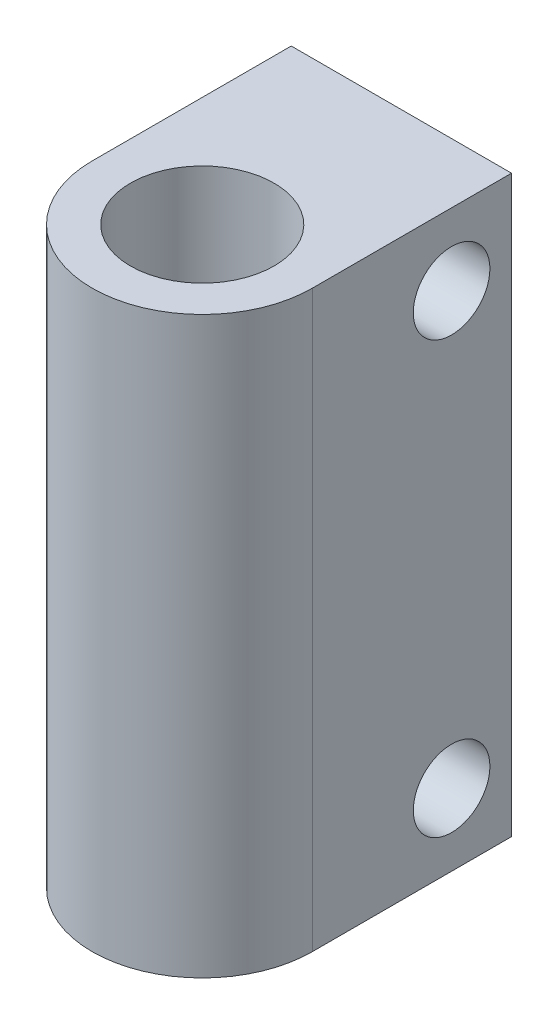
ISO-10303-21;
HEADER;
FILE_DESCRIPTION(('STEP AP214'),'2;1');
FILE_NAME('part.step','',(''),(''),'','','');
FILE_SCHEMA(('AUTOMOTIVE_DESIGN { 1 0 10303 214 1 1 1 1 }'));
ENDSEC;
DATA;
#1=APPLICATION_CONTEXT('core data for automotive mechanical design processes');
#2=APPLICATION_PROTOCOL_DEFINITION('international standard','automotive_design',2000,#1);
#3=PRODUCT_CONTEXT('',#1,'mechanical');
#4=PRODUCT('Part','Part','',(#3));
#5=PRODUCT_RELATED_PRODUCT_CATEGORY('part','',(#4));
#6=PRODUCT_DEFINITION_FORMATION('','',#4);
#7=PRODUCT_DEFINITION_CONTEXT('part definition',#1,'design');
#8=PRODUCT_DEFINITION('design','',#6,#7);
#9=PRODUCT_DEFINITION_SHAPE('','',#8);
#10=(LENGTH_UNIT() NAMED_UNIT(*) SI_UNIT(.MILLI.,.METRE.));
#11=(NAMED_UNIT(*) PLANE_ANGLE_UNIT() SI_UNIT($,.RADIAN.));
#12=(NAMED_UNIT(*) SI_UNIT($,.STERADIAN.) SOLID_ANGLE_UNIT());
#13=UNCERTAINTY_MEASURE_WITH_UNIT(LENGTH_MEASURE(1.E-05),#10,'distance_accuracy_value','');
#14=(GEOMETRIC_REPRESENTATION_CONTEXT(3) GLOBAL_UNCERTAINTY_ASSIGNED_CONTEXT((#13)) GLOBAL_UNIT_ASSIGNED_CONTEXT((#10,
#11,#12)) REPRESENTATION_CONTEXT('',''));
#15=CARTESIAN_POINT('',(0.,0.,0.));
#16=DIRECTION('',(0.,0.,1.));
#17=DIRECTION('',(1.,0.,0.));
#18=AXIS2_PLACEMENT_3D('',#15,#16,#17);
#19=CARTESIAN_POINT('',(0.,60.,0.));
#20=DIRECTION('',(0.,1.,0.));
#21=DIRECTION('',(0.,0.,1.));
#22=AXIS2_PLACEMENT_3D('',#19,#20,#21);
#23=PLANE('',#22);
#24=CARTESIAN_POINT('',(0.,60.,0.));
#25=DIRECTION('',(0.,1.,0.));
#26=DIRECTION('',(0.,0.,1.));
#27=AXIS2_PLACEMENT_3D('',#24,#25,#26);
#28=CIRCLE('',#27,11.5);
#29=CARTESIAN_POINT('',(-11.5,60.,0.));
#30=VERTEX_POINT('',#29);
#31=CARTESIAN_POINT('',(11.5,60.,0.));
#32=VERTEX_POINT('',#31);
#33=EDGE_CURVE('E86',#30,#32,#28,.T.);
#34=ORIENTED_EDGE('',*,*,#33,.T.);
#35=DIRECTION('',(0.,0.,-1.));
#36=VECTOR('',#35,1.);
#37=CARTESIAN_POINT('',(11.5,60.,0.));
#38=LINE('',#37,#36);
#39=CARTESIAN_POINT('',(11.5,60.,-20.7933592225516));
#40=VERTEX_POINT('',#39);
#41=EDGE_CURVE('E81',#32,#40,#38,.T.);
#42=ORIENTED_EDGE('',*,*,#41,.T.);
#43=DIRECTION('',(-1.,0.,0.));
#44=VECTOR('',#43,1.);
#45=CARTESIAN_POINT('',(11.5,60.,-20.7933592225516));
#46=LINE('',#45,#44);
#47=CARTESIAN_POINT('',(-11.5,60.,-20.7933592225515));
#48=VERTEX_POINT('',#47);
#49=EDGE_CURVE('E84',#40,#48,#46,.T.);
#50=ORIENTED_EDGE('',*,*,#49,.T.);
#51=DIRECTION('',(0.,0.,1.));
#52=VECTOR('',#51,1.);
#53=CARTESIAN_POINT('',(-11.5,60.,0.));
#54=LINE('',#53,#52);
#55=EDGE_CURVE('E51',#48,#30,#54,.T.);
#56=ORIENTED_EDGE('',*,*,#55,.T.);
#57=EDGE_LOOP('',(#34,#42,#50,#56));
#58=FACE_BOUND('',#57,.T.);
#59=CARTESIAN_POINT('',(0.,60.,0.));
#60=DIRECTION('',(0.,1.,0.));
#61=DIRECTION('',(0.,0.,1.));
#62=AXIS2_PLACEMENT_3D('',#59,#60,#61);
#63=CIRCLE('',#62,7.5);
#64=CARTESIAN_POINT('',(0.,60.,7.5));
#65=VERTEX_POINT('',#64);
#66=EDGE_CURVE('E102',#65,#65,#63,.T.);
#67=ORIENTED_EDGE('',*,*,#66,.F.);
#68=EDGE_LOOP('',(#67));
#69=FACE_BOUND('',#68,.T.);
#70=ADVANCED_FACE('F32',(#58,#69),#23,.T.);
#71=CARTESIAN_POINT('',(0.,0.,0.));
#72=DIRECTION('',(0.,1.,0.));
#73=DIRECTION('',(0.,0.,1.));
#74=AXIS2_PLACEMENT_3D('',#71,#72,#73);
#75=PLANE('',#74);
#76=CARTESIAN_POINT('',(0.,0.,0.));
#77=DIRECTION('',(0.,1.,0.));
#78=DIRECTION('',(0.,0.,1.));
#79=AXIS2_PLACEMENT_3D('',#76,#77,#78);
#80=CIRCLE('',#79,11.5);
#81=CARTESIAN_POINT('',(-11.5,0.,0.));
#82=VERTEX_POINT('',#81);
#83=CARTESIAN_POINT('',(11.5,0.,0.));
#84=VERTEX_POINT('',#83);
#85=EDGE_CURVE('E99',#82,#84,#80,.T.);
#86=ORIENTED_EDGE('',*,*,#85,.F.);
#87=DIRECTION('',(0.,0.,1.));
#88=VECTOR('',#87,1.);
#89=CARTESIAN_POINT('',(-11.5,0.,0.));
#90=LINE('',#89,#88);
#91=CARTESIAN_POINT('',(-11.5,0.,-20.7933592225515));
#92=VERTEX_POINT('',#91);
#93=EDGE_CURVE('E74',#92,#82,#90,.T.);
#94=ORIENTED_EDGE('',*,*,#93,.F.);
#95=DIRECTION('',(-1.,0.,0.));
#96=VECTOR('',#95,1.);
#97=CARTESIAN_POINT('',(11.5,0.,-20.7933592225516));
#98=LINE('',#97,#96);
#99=CARTESIAN_POINT('',(11.5,0.,-20.7933592225516));
#100=VERTEX_POINT('',#99);
#101=EDGE_CURVE('E68',#100,#92,#98,.T.);
#102=ORIENTED_EDGE('',*,*,#101,.F.);
#103=DIRECTION('',(0.,0.,-1.));
#104=VECTOR('',#103,1.);
#105=CARTESIAN_POINT('',(11.5,0.,0.));
#106=LINE('',#105,#104);
#107=EDGE_CURVE('E90',#84,#100,#106,.T.);
#108=ORIENTED_EDGE('',*,*,#107,.F.);
#109=EDGE_LOOP('',(#86,#94,#102,#108));
#110=FACE_BOUND('',#109,.T.);
#111=CARTESIAN_POINT('',(0.,0.,0.));
#112=DIRECTION('',(0.,1.,0.));
#113=DIRECTION('',(0.,0.,1.));
#114=AXIS2_PLACEMENT_3D('',#111,#112,#113);
#115=CIRCLE('',#114,7.5);
#116=CARTESIAN_POINT('',(0.,0.,7.5));
#117=VERTEX_POINT('',#116);
#118=EDGE_CURVE('E109',#117,#117,#115,.T.);
#119=ORIENTED_EDGE('',*,*,#118,.T.);
#120=EDGE_LOOP('',(#119));
#121=FACE_BOUND('',#120,.T.);
#122=ADVANCED_FACE('F129',(#110,#121),#75,.F.);
#123=CARTESIAN_POINT('',(0.,60.,0.));
#124=DIRECTION('',(0.,-1.,0.));
#125=DIRECTION('',(0.,0.,-1.));
#126=AXIS2_PLACEMENT_3D('',#123,#124,#125);
#127=CYLINDRICAL_SURFACE('',#126,11.5);
#128=ORIENTED_EDGE('',*,*,#85,.T.);
#129=DIRECTION('',(0.,-1.,0.));
#130=VECTOR('',#129,1.);
#131=CARTESIAN_POINT('',(11.5,60.,0.));
#132=LINE('',#131,#130);
#133=EDGE_CURVE('E11',#32,#84,#132,.T.);
#134=ORIENTED_EDGE('',*,*,#133,.F.);
#135=ORIENTED_EDGE('',*,*,#33,.F.);
#136=DIRECTION('',(0.,-1.,0.));
#137=VECTOR('',#136,1.);
#138=CARTESIAN_POINT('',(-11.5,60.,0.));
#139=LINE('',#138,#137);
#140=EDGE_CURVE('E95',#30,#82,#139,.T.);
#141=ORIENTED_EDGE('',*,*,#140,.T.);
#142=EDGE_LOOP('',(#128,#134,#135,#141));
#143=FACE_BOUND('',#142,.T.);
#144=ADVANCED_FACE('F34',(#143),#127,.T.);
#145=CARTESIAN_POINT('',(11.5,60.,0.));
#146=DIRECTION('',(-1.,0.,0.));
#147=DIRECTION('',(0.,0.,1.));
#148=AXIS2_PLACEMENT_3D('',#145,#146,#147);
#149=PLANE('',#148);
#150=CARTESIAN_POINT('',(11.5,7.5,-14.5373250789547));
#151=DIRECTION('',(1.,0.,0.));
#152=DIRECTION('',(0.,0.,-1.));
#153=AXIS2_PLACEMENT_3D('',#150,#151,#152);
#154=CIRCLE('',#153,4.);
#155=CARTESIAN_POINT('',(11.5,7.5,-18.5373250789547));
#156=VERTEX_POINT('',#155);
#157=EDGE_CURVE('E120',#156,#156,#154,.T.);
#158=ORIENTED_EDGE('',*,*,#157,.F.);
#159=EDGE_LOOP('',(#158));
#160=FACE_BOUND('',#159,.T.);
#161=CARTESIAN_POINT('',(11.5,52.5,-14.5373250789547));
#162=DIRECTION('',(1.,0.,0.));
#163=DIRECTION('',(0.,0.,-1.));
#164=AXIS2_PLACEMENT_3D('',#161,#162,#163);
#165=CIRCLE('',#164,4.);
#166=CARTESIAN_POINT('',(11.5,52.5,-18.5373250789547));
#167=VERTEX_POINT('',#166);
#168=EDGE_CURVE('E110',#167,#167,#165,.T.);
#169=ORIENTED_EDGE('',*,*,#168,.F.);
#170=EDGE_LOOP('',(#169));
#171=FACE_BOUND('',#170,.T.);
#172=ORIENTED_EDGE('',*,*,#107,.T.);
#173=DIRECTION('',(0.,-1.,0.));
#174=VECTOR('',#173,1.);
#175=CARTESIAN_POINT('',(11.5,60.,-20.7933592225516));
#176=LINE('',#175,#174);
#177=EDGE_CURVE('E42',#40,#100,#176,.T.);
#178=ORIENTED_EDGE('',*,*,#177,.F.);
#179=ORIENTED_EDGE('',*,*,#41,.F.);
#180=ORIENTED_EDGE('',*,*,#133,.T.);
#181=EDGE_LOOP('',(#172,#178,#179,#180));
#182=FACE_BOUND('',#181,.T.);
#183=ADVANCED_FACE('F89',(#160,#171,#182),#149,.F.);
#184=CARTESIAN_POINT('',(11.5,60.,-20.7933592225516));
#185=DIRECTION('',(0.,0.,1.));
#186=DIRECTION('',(1.,0.,0.));
#187=AXIS2_PLACEMENT_3D('',#184,#185,#186);
#188=PLANE('',#187);
#189=ORIENTED_EDGE('',*,*,#101,.T.);
#190=DIRECTION('',(0.,-1.,0.));
#191=VECTOR('',#190,1.);
#192=CARTESIAN_POINT('',(-11.5,60.,-20.7933592225515));
#193=LINE('',#192,#191);
#194=EDGE_CURVE('E91',#48,#92,#193,.T.);
#195=ORIENTED_EDGE('',*,*,#194,.F.);
#196=ORIENTED_EDGE('',*,*,#49,.F.);
#197=ORIENTED_EDGE('',*,*,#177,.T.);
#198=EDGE_LOOP('',(#189,#195,#196,#197));
#199=FACE_BOUND('',#198,.T.);
#200=ADVANCED_FACE('F93',(#199),#188,.F.);
#201=CARTESIAN_POINT('',(-11.5,60.,0.));
#202=DIRECTION('',(1.,0.,0.));
#203=DIRECTION('',(0.,0.,-1.));
#204=AXIS2_PLACEMENT_3D('',#201,#202,#203);
#205=PLANE('',#204);
#206=CARTESIAN_POINT('',(-11.5,7.5,-14.5373250789547));
#207=DIRECTION('',(1.,0.,0.));
#208=DIRECTION('',(0.,0.,-1.));
#209=AXIS2_PLACEMENT_3D('',#206,#207,#208);
#210=CIRCLE('',#209,4.);
#211=CARTESIAN_POINT('',(-11.5,7.5,-18.5373250789547));
#212=VERTEX_POINT('',#211);
#213=EDGE_CURVE('E36',#212,#212,#210,.T.);
#214=ORIENTED_EDGE('',*,*,#213,.T.);
#215=EDGE_LOOP('',(#214));
#216=FACE_BOUND('',#215,.T.);
#217=CARTESIAN_POINT('',(-11.5,52.5,-14.5373250789547));
#218=DIRECTION('',(1.,0.,0.));
#219=DIRECTION('',(0.,0.,-1.));
#220=AXIS2_PLACEMENT_3D('',#217,#218,#219);
#221=CIRCLE('',#220,4.);
#222=CARTESIAN_POINT('',(-11.5,52.5,-18.5373250789547));
#223=VERTEX_POINT('',#222);
#224=EDGE_CURVE('E107',#223,#223,#221,.T.);
#225=ORIENTED_EDGE('',*,*,#224,.T.);
#226=EDGE_LOOP('',(#225));
#227=FACE_BOUND('',#226,.T.);
#228=ORIENTED_EDGE('',*,*,#93,.T.);
#229=ORIENTED_EDGE('',*,*,#140,.F.);
#230=ORIENTED_EDGE('',*,*,#55,.F.);
#231=ORIENTED_EDGE('',*,*,#194,.T.);
#232=EDGE_LOOP('',(#228,#229,#230,#231));
#233=FACE_BOUND('',#232,.T.);
#234=ADVANCED_FACE('F139',(#216,#227,#233),#205,.F.);
#235=CARTESIAN_POINT('',(0.,60.,0.));
#236=DIRECTION('',(0.,-1.,0.));
#237=DIRECTION('',(0.,0.,-1.));
#238=AXIS2_PLACEMENT_3D('',#235,#236,#237);
#239=CYLINDRICAL_SURFACE('',#238,7.5);
#240=ORIENTED_EDGE('',*,*,#66,.T.);
#241=EDGE_LOOP('',(#240));
#242=FACE_BOUND('',#241,.T.);
#243=ORIENTED_EDGE('',*,*,#118,.F.);
#244=EDGE_LOOP('',(#243));
#245=FACE_BOUND('',#244,.T.);
#246=ADVANCED_FACE('F126',(#242,#245),#239,.F.);
#247=CARTESIAN_POINT('',(-38.5,52.5,-14.5373250789547));
#248=DIRECTION('',(1.,0.,0.));
#249=DIRECTION('',(0.,0.,-1.));
#250=AXIS2_PLACEMENT_3D('',#247,#248,#249);
#251=CYLINDRICAL_SURFACE('',#250,4.);
#252=ORIENTED_EDGE('',*,*,#168,.T.);
#253=EDGE_LOOP('',(#252));
#254=FACE_BOUND('',#253,.T.);
#255=ORIENTED_EDGE('',*,*,#224,.F.);
#256=EDGE_LOOP('',(#255));
#257=FACE_BOUND('',#256,.T.);
#258=ADVANCED_FACE('F157',(#254,#257),#251,.F.);
#259=CARTESIAN_POINT('',(-38.5,7.5,-14.5373250789547));
#260=DIRECTION('',(1.,0.,0.));
#261=DIRECTION('',(0.,0.,-1.));
#262=AXIS2_PLACEMENT_3D('',#259,#260,#261);
#263=CYLINDRICAL_SURFACE('',#262,4.);
#264=ORIENTED_EDGE('',*,*,#157,.T.);
#265=EDGE_LOOP('',(#264));
#266=FACE_BOUND('',#265,.T.);
#267=ORIENTED_EDGE('',*,*,#213,.F.);
#268=EDGE_LOOP('',(#267));
#269=FACE_BOUND('',#268,.T.);
#270=ADVANCED_FACE('F154',(#266,#269),#263,.F.);
#271=CLOSED_SHELL('',(#70,#122,#144,#183,#200,#234,#246,#258,#270));
#272=MANIFOLD_SOLID_BREP('B2',#271);
#273=ADVANCED_BREP_SHAPE_REPRESENTATION('',(#18,#272),#14);
#274=SHAPE_DEFINITION_REPRESENTATION(#9,#273);
ENDSEC;
END-ISO-10303-21;
